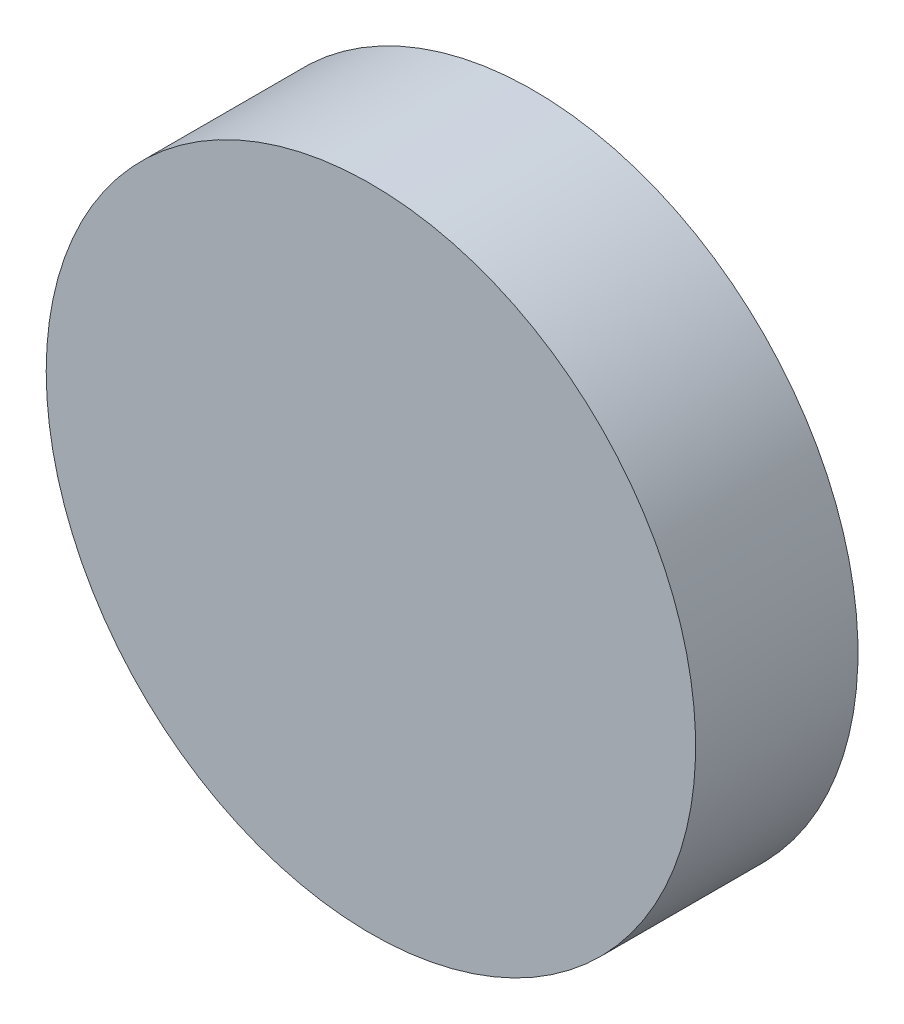
ISO-10303-21;
HEADER;
FILE_DESCRIPTION(('STEP AP214'),'2;1');
FILE_NAME('part.step','',(''),(''),'','','');
FILE_SCHEMA(('AUTOMOTIVE_DESIGN { 1 0 10303 214 1 1 1 1 }'));
ENDSEC;
DATA;
#1=APPLICATION_CONTEXT('core data for automotive mechanical design processes');
#2=APPLICATION_PROTOCOL_DEFINITION('international standard','automotive_design',2000,#1);
#3=PRODUCT_CONTEXT('',#1,'mechanical');
#4=PRODUCT('Part','Part','',(#3));
#5=PRODUCT_RELATED_PRODUCT_CATEGORY('part','',(#4));
#6=PRODUCT_DEFINITION_FORMATION('','',#4);
#7=PRODUCT_DEFINITION_CONTEXT('part definition',#1,'design');
#8=PRODUCT_DEFINITION('design','',#6,#7);
#9=PRODUCT_DEFINITION_SHAPE('','',#8);
#10=(LENGTH_UNIT() NAMED_UNIT(*) SI_UNIT(.MILLI.,.METRE.));
#11=(NAMED_UNIT(*) PLANE_ANGLE_UNIT() SI_UNIT($,.RADIAN.));
#12=(NAMED_UNIT(*) SI_UNIT($,.STERADIAN.) SOLID_ANGLE_UNIT());
#13=UNCERTAINTY_MEASURE_WITH_UNIT(LENGTH_MEASURE(1.E-05),#10,'distance_accuracy_value','');
#14=(GEOMETRIC_REPRESENTATION_CONTEXT(3) GLOBAL_UNCERTAINTY_ASSIGNED_CONTEXT((#13)) GLOBAL_UNIT_ASSIGNED_CONTEXT((#10,
#11,#12)) REPRESENTATION_CONTEXT('',''));
#15=CARTESIAN_POINT('',(0.,0.,0.));
#16=DIRECTION('',(0.,0.,1.));
#17=DIRECTION('',(1.,0.,0.));
#18=AXIS2_PLACEMENT_3D('',#15,#16,#17);
#19=CARTESIAN_POINT('',(0.,0.,0.));
#20=DIRECTION('',(0.,0.,1.));
#21=DIRECTION('',(1.,0.,0.));
#22=AXIS2_PLACEMENT_3D('',#19,#20,#21);
#23=PLANE('',#22);
#24=CARTESIAN_POINT('',(0.,0.,0.));
#25=DIRECTION('',(0.,0.,-1.));
#26=DIRECTION('',(-1.,0.,0.));
#27=AXIS2_PLACEMENT_3D('',#24,#25,#26);
#28=CIRCLE('',#27,1.);
#29=CARTESIAN_POINT('',(-1.,0.,0.));
#30=VERTEX_POINT('',#29);
#31=EDGE_CURVE('E18',#30,#30,#28,.F.);
#32=ORIENTED_EDGE('',*,*,#31,.F.);
#33=EDGE_LOOP('',(#32));
#34=FACE_BOUND('',#33,.T.);
#35=ADVANCED_FACE('F15',(#34),#23,.F.);
#36=CARTESIAN_POINT('',(0.,0.,0.5));
#37=DIRECTION('',(0.,0.,-1.));
#38=DIRECTION('',(-1.,0.,0.));
#39=AXIS2_PLACEMENT_3D('',#36,#37,#38);
#40=CYLINDRICAL_SURFACE('',#39,1.);
#41=ORIENTED_EDGE('',*,*,#31,.T.);
#42=EDGE_LOOP('',(#41));
#43=FACE_BOUND('',#42,.T.);
#44=CARTESIAN_POINT('',(0.,0.,0.5));
#45=DIRECTION('',(0.,0.,-1.));
#46=DIRECTION('',(-1.,0.,0.));
#47=AXIS2_PLACEMENT_3D('',#44,#45,#46);
#48=CIRCLE('',#47,1.);
#49=CARTESIAN_POINT('',(-1.,0.,0.5));
#50=VERTEX_POINT('',#49);
#51=EDGE_CURVE('E10',#50,#50,#48,.F.);
#52=ORIENTED_EDGE('',*,*,#51,.F.);
#53=EDGE_LOOP('',(#52));
#54=FACE_BOUND('',#53,.T.);
#55=ADVANCED_FACE('F27',(#43,#54),#40,.T.);
#56=CARTESIAN_POINT('',(0.,0.,0.5));
#57=DIRECTION('',(0.,0.,1.));
#58=DIRECTION('',(1.,0.,0.));
#59=AXIS2_PLACEMENT_3D('',#56,#57,#58);
#60=PLANE('',#59);
#61=ORIENTED_EDGE('',*,*,#51,.T.);
#62=EDGE_LOOP('',(#61));
#63=FACE_BOUND('',#62,.T.);
#64=ADVANCED_FACE('F35',(#63),#60,.T.);
#65=CLOSED_SHELL('',(#35,#55,#64));
#66=MANIFOLD_SOLID_BREP('B1',#65);
#67=ADVANCED_BREP_SHAPE_REPRESENTATION('',(#18,#66),#14);
#68=SHAPE_DEFINITION_REPRESENTATION(#9,#67);
ENDSEC;
END-ISO-10303-21;
